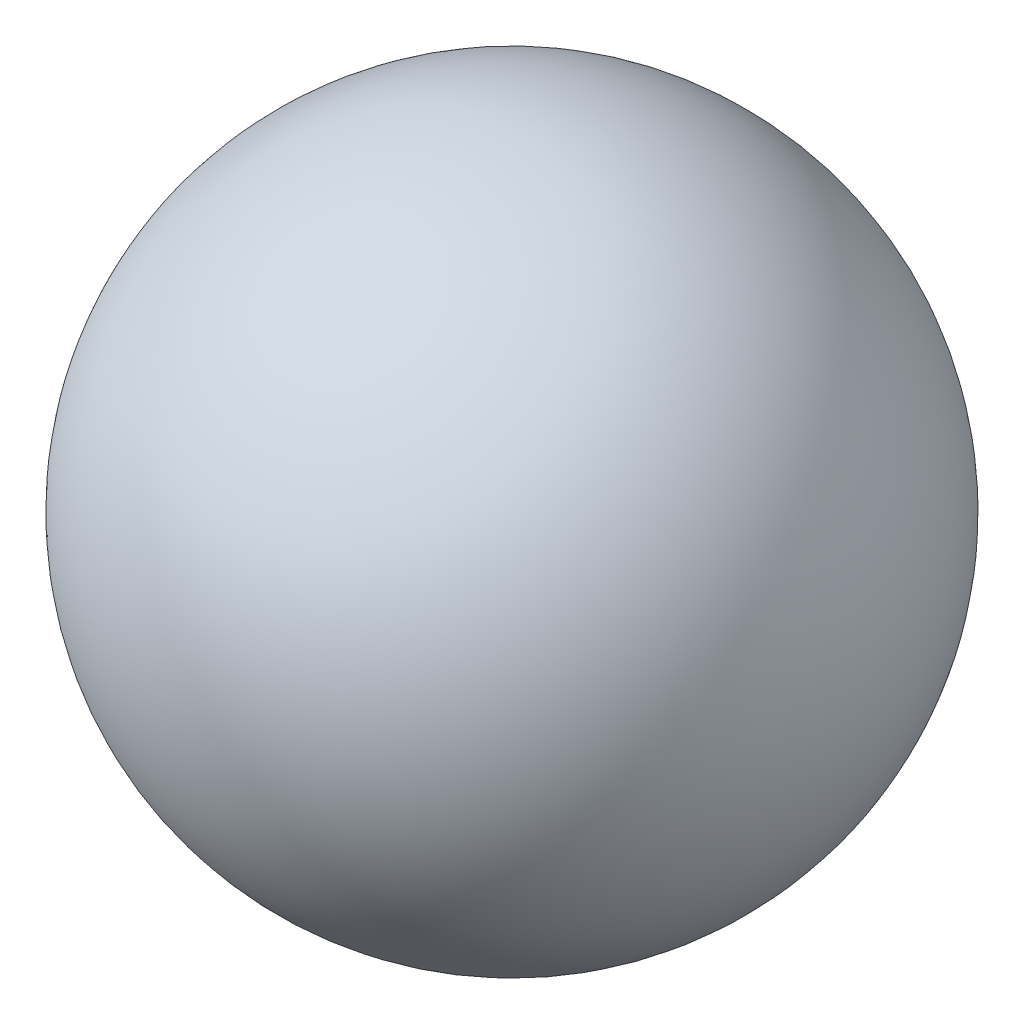
ISO-10303-21;
HEADER;
FILE_DESCRIPTION(('STEP AP214'),'2;1');
FILE_NAME('part.step','',(''),(''),'','','');
FILE_SCHEMA(('AUTOMOTIVE_DESIGN { 1 0 10303 214 1 1 1 1 }'));
ENDSEC;
DATA;
#1=APPLICATION_CONTEXT('core data for automotive mechanical design processes');
#2=APPLICATION_PROTOCOL_DEFINITION('international standard','automotive_design',2000,#1);
#3=PRODUCT_CONTEXT('',#1,'mechanical');
#4=PRODUCT('Part','Part','',(#3));
#5=PRODUCT_RELATED_PRODUCT_CATEGORY('part','',(#4));
#6=PRODUCT_DEFINITION_FORMATION('','',#4);
#7=PRODUCT_DEFINITION_CONTEXT('part definition',#1,'design');
#8=PRODUCT_DEFINITION('design','',#6,#7);
#9=PRODUCT_DEFINITION_SHAPE('','',#8);
#10=(LENGTH_UNIT() NAMED_UNIT(*) SI_UNIT(.MILLI.,.METRE.));
#11=(NAMED_UNIT(*) PLANE_ANGLE_UNIT() SI_UNIT($,.RADIAN.));
#12=(NAMED_UNIT(*) SI_UNIT($,.STERADIAN.) SOLID_ANGLE_UNIT());
#13=UNCERTAINTY_MEASURE_WITH_UNIT(LENGTH_MEASURE(1.E-05),#10,'distance_accuracy_value','');
#14=(GEOMETRIC_REPRESENTATION_CONTEXT(3) GLOBAL_UNCERTAINTY_ASSIGNED_CONTEXT((#13)) GLOBAL_UNIT_ASSIGNED_CONTEXT((#10,
#11,#12)) REPRESENTATION_CONTEXT('',''));
#15=CARTESIAN_POINT('',(0.,0.,0.));
#16=DIRECTION('',(0.,0.,1.));
#17=DIRECTION('',(1.,0.,0.));
#18=AXIS2_PLACEMENT_3D('',#15,#16,#17);
#19=CARTESIAN_POINT('',(0.,0.,0.));
#20=DIRECTION('',(-1.,0.,0.));
#21=DIRECTION('',(0.,1.,0.));
#22=AXIS2_PLACEMENT_3D('',#19,#20,#21);
#23=SPHERICAL_SURFACE('',#22,12.);
#24=CARTESIAN_POINT('',(-12.,0.,0.));
#25=VERTEX_POINT('',#24);
#26=VERTEX_LOOP('',#25);
#27=FACE_BOUND('',#26,.T.);
#28=ADVANCED_FACE('F39',(#27),#23,.T.);
#29=CLOSED_SHELL('',(#28));
#30=MANIFOLD_SOLID_BREP('B2',#29);
#31=ADVANCED_BREP_SHAPE_REPRESENTATION('',(#18,#30),#14);
#32=SHAPE_DEFINITION_REPRESENTATION(#9,#31);
ENDSEC;
END-ISO-10303-21;
